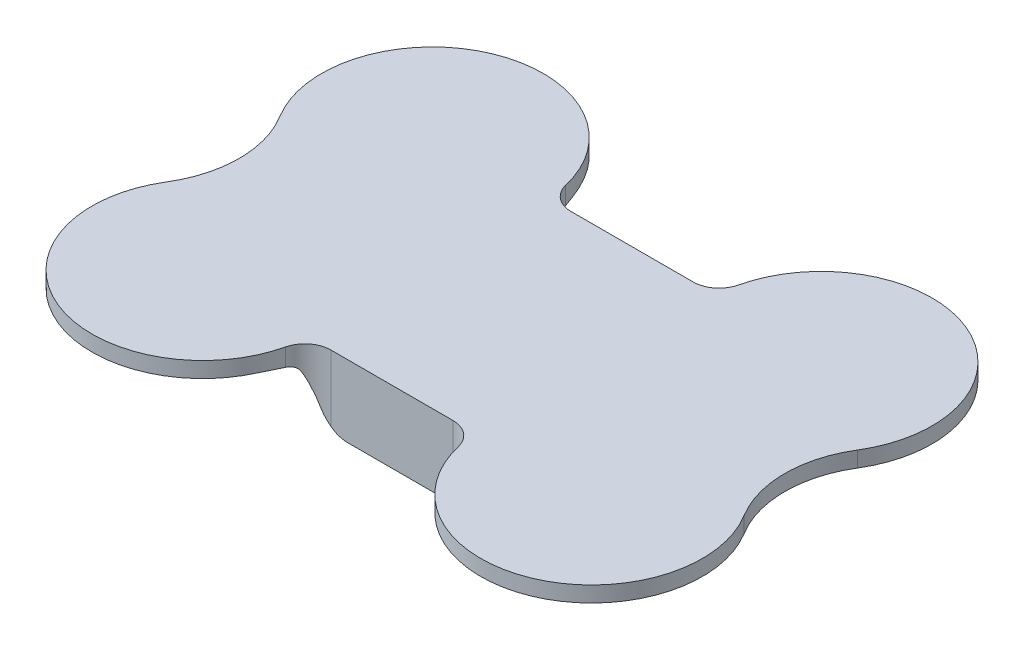
ISO-10303-21;
HEADER;
FILE_DESCRIPTION(('STEP AP214'),'2;1');
FILE_NAME('part.step','',(''),(''),'','','');
FILE_SCHEMA(('AUTOMOTIVE_DESIGN { 1 0 10303 214 1 1 1 1 }'));
ENDSEC;
DATA;
#1=APPLICATION_CONTEXT('core data for automotive mechanical design processes');
#2=APPLICATION_PROTOCOL_DEFINITION('international standard','automotive_design',2000,#1);
#3=PRODUCT_CONTEXT('',#1,'mechanical');
#4=PRODUCT('Part','Part','',(#3));
#5=PRODUCT_RELATED_PRODUCT_CATEGORY('part','',(#4));
#6=PRODUCT_DEFINITION_FORMATION('','',#4);
#7=PRODUCT_DEFINITION_CONTEXT('part definition',#1,'design');
#8=PRODUCT_DEFINITION('design','',#6,#7);
#9=PRODUCT_DEFINITION_SHAPE('','',#8);
#10=(LENGTH_UNIT() NAMED_UNIT(*) SI_UNIT(.MILLI.,.METRE.));
#11=(NAMED_UNIT(*) PLANE_ANGLE_UNIT() SI_UNIT($,.RADIAN.));
#12=(NAMED_UNIT(*) SI_UNIT($,.STERADIAN.) SOLID_ANGLE_UNIT());
#13=UNCERTAINTY_MEASURE_WITH_UNIT(LENGTH_MEASURE(1.E-05),#10,'distance_accuracy_value','');
#14=(GEOMETRIC_REPRESENTATION_CONTEXT(3) GLOBAL_UNCERTAINTY_ASSIGNED_CONTEXT((#13)) GLOBAL_UNIT_ASSIGNED_CONTEXT((#10,
#11,#12)) REPRESENTATION_CONTEXT('',''));
#15=CARTESIAN_POINT('',(0.,0.,0.));
#16=DIRECTION('',(0.,0.,1.));
#17=DIRECTION('',(1.,0.,0.));
#18=AXIS2_PLACEMENT_3D('',#15,#16,#17);
#19=CARTESIAN_POINT('',(-23.3898248877975,29.,46.));
#20=DIRECTION('',(0.,0.,-1.));
#21=DIRECTION('',(-1.,0.,0.));
#22=AXIS2_PLACEMENT_3D('',#19,#20,#21);
#23=PLANE('',#22);
#24=DIRECTION('',(1.,0.,0.));
#25=VECTOR('',#24,1.);
#26=CARTESIAN_POINT('',(-23.3898248877975,1.44303079657456,46.));
#27=LINE('',#26,#25);
#28=CARTESIAN_POINT('',(-17.11441241498,1.44303079657456,46.));
#29=VERTEX_POINT('',#28);
#30=CARTESIAN_POINT('',(17.1144124149762,1.44303079657455,46.));
#31=VERTEX_POINT('',#30);
#32=EDGE_CURVE('E185',#29,#31,#27,.T.);
#33=ORIENTED_EDGE('',*,*,#32,.T.);
#34=CARTESIAN_POINT('',(17.1144124149761,11.4430307965746,46.));
#35=DIRECTION('',(0.,0.,-1.));
#36=DIRECTION('',(-1.,0.,0.));
#37=AXIS2_PLACEMENT_3D('',#34,#35,#36);
#38=CIRCLE('',#37,10.);
#39=CARTESIAN_POINT('',(23.3898248877936,3.65719761726697,46.));
#40=VERTEX_POINT('',#39);
#41=EDGE_CURVE('E265',#31,#40,#38,.F.);
#42=ORIENTED_EDGE('',*,*,#41,.T.);
#43=DIRECTION('',(0.,-1.,0.));
#44=VECTOR('',#43,1.);
#45=CARTESIAN_POINT('',(23.3898248877936,29.,46.));
#46=LINE('',#45,#44);
#47=CARTESIAN_POINT('',(23.3898248877936,29.,46.));
#48=VERTEX_POINT('',#47);
#49=EDGE_CURVE('E520',#48,#40,#46,.T.);
#50=ORIENTED_EDGE('',*,*,#49,.F.);
#51=DIRECTION('',(1.,0.,0.));
#52=VECTOR('',#51,1.);
#53=CARTESIAN_POINT('',(-23.3898248877975,29.,46.));
#54=LINE('',#53,#52);
#55=CARTESIAN_POINT('',(-23.3898248877975,29.,46.));
#56=VERTEX_POINT('',#55);
#57=EDGE_CURVE('E481',#56,#48,#54,.T.);
#58=ORIENTED_EDGE('',*,*,#57,.F.);
#59=DIRECTION('',(0.,-1.,0.));
#60=VECTOR('',#59,1.);
#61=CARTESIAN_POINT('',(-23.3898248877975,29.,46.));
#62=LINE('',#61,#60);
#63=CARTESIAN_POINT('',(-23.3898248877975,3.65719761726697,46.));
#64=VERTEX_POINT('',#63);
#65=EDGE_CURVE('E209',#56,#64,#62,.T.);
#66=ORIENTED_EDGE('',*,*,#65,.T.);
#67=CARTESIAN_POINT('',(-17.11441241498,11.4430307965746,46.));
#68=DIRECTION('',(0.,0.,-1.));
#69=DIRECTION('',(-1.,0.,0.));
#70=AXIS2_PLACEMENT_3D('',#67,#68,#69);
#71=CIRCLE('',#70,10.);
#72=EDGE_CURVE('E200',#64,#29,#71,.F.);
#73=ORIENTED_EDGE('',*,*,#72,.T.);
#74=EDGE_LOOP('',(#33,#42,#50,#58,#66,#73));
#75=FACE_BOUND('',#74,.T.);
#76=ADVANCED_FACE('F43',(#75),#23,.F.);
#77=CARTESIAN_POINT('',(-23.3898248877976,29.,-46.));
#78=DIRECTION('',(0.,0.,1.));
#79=DIRECTION('',(1.,0.,0.));
#80=AXIS2_PLACEMENT_3D('',#77,#78,#79);
#81=PLANE('',#80);
#82=DIRECTION('',(0.,-1.,0.));
#83=VECTOR('',#82,1.);
#84=CARTESIAN_POINT('',(23.3898248877935,29.,-46.));
#85=LINE('',#84,#83);
#86=CARTESIAN_POINT('',(23.3898248877935,29.,-46.));
#87=VERTEX_POINT('',#86);
#88=CARTESIAN_POINT('',(23.3898248877935,3.65719761726694,-46.));
#89=VERTEX_POINT('',#88);
#90=EDGE_CURVE('E504',#87,#89,#85,.T.);
#91=ORIENTED_EDGE('',*,*,#90,.T.);
#92=CARTESIAN_POINT('',(17.1144124149761,11.4430307965746,-46.));
#93=DIRECTION('',(0.,0.,1.));
#94=DIRECTION('',(1.,0.,0.));
#95=AXIS2_PLACEMENT_3D('',#92,#93,#94);
#96=CIRCLE('',#95,10.);
#97=CARTESIAN_POINT('',(17.1144124149762,1.44303079657455,-46.));
#98=VERTEX_POINT('',#97);
#99=EDGE_CURVE('E388',#89,#98,#96,.F.);
#100=ORIENTED_EDGE('',*,*,#99,.T.);
#101=DIRECTION('',(-1.,0.,0.));
#102=VECTOR('',#101,1.);
#103=CARTESIAN_POINT('',(-23.3898248877976,1.44303079657456,-46.));
#104=LINE('',#103,#102);
#105=CARTESIAN_POINT('',(-17.11441241498,1.44303079657456,-46.));
#106=VERTEX_POINT('',#105);
#107=EDGE_CURVE('E379',#98,#106,#104,.T.);
#108=ORIENTED_EDGE('',*,*,#107,.T.);
#109=CARTESIAN_POINT('',(-17.11441241498,11.4430307965746,-46.));
#110=DIRECTION('',(0.,0.,1.));
#111=DIRECTION('',(1.,0.,0.));
#112=AXIS2_PLACEMENT_3D('',#109,#110,#111);
#113=CIRCLE('',#112,10.);
#114=CARTESIAN_POINT('',(-23.3898248877975,3.657197617267,-46.));
#115=VERTEX_POINT('',#114);
#116=EDGE_CURVE('E202',#106,#115,#113,.F.);
#117=ORIENTED_EDGE('',*,*,#116,.T.);
#118=DIRECTION('',(0.,-1.,0.));
#119=VECTOR('',#118,1.);
#120=CARTESIAN_POINT('',(-23.3898248877976,29.,-46.));
#121=LINE('',#120,#119);
#122=CARTESIAN_POINT('',(-23.3898248877976,29.,-46.));
#123=VERTEX_POINT('',#122);
#124=EDGE_CURVE('E501',#123,#115,#121,.T.);
#125=ORIENTED_EDGE('',*,*,#124,.F.);
#126=DIRECTION('',(-1.,0.,0.));
#127=VECTOR('',#126,1.);
#128=CARTESIAN_POINT('',(-23.3898248877976,29.,-46.));
#129=LINE('',#128,#127);
#130=EDGE_CURVE('E68',#87,#123,#129,.T.);
#131=ORIENTED_EDGE('',*,*,#130,.F.);
#132=EDGE_LOOP('',(#91,#100,#108,#117,#125,#131));
#133=FACE_BOUND('',#132,.T.);
#134=ADVANCED_FACE('F337',(#133),#81,.F.);
#135=CARTESIAN_POINT('',(-23.3898248877976,29.,-56.));
#136=DIRECTION('',(0.,-1.,0.));
#137=DIRECTION('',(0.,0.,-1.));
#138=AXIS2_PLACEMENT_3D('',#135,#136,#137);
#139=CYLINDRICAL_SURFACE('',#138,10.);
#140=ORIENTED_EDGE('',*,*,#124,.T.);
#141=CARTESIAN_POINT('',(-23.3898248877976,3.657197617267,-46.));
#142=CARTESIAN_POINT('',(-23.6061617882448,3.8315117228237,-45.9999931890815));
#143=CARTESIAN_POINT('',(-23.8150670842934,4.01481210974495,-46.0070183770402));
#144=CARTESIAN_POINT('',(-24.2164720639477,4.39765014582778,-46.0322007477987));
#145=CARTESIAN_POINT('',(-24.4089823645958,4.59717712078334,-46.0503506630672));
#146=CARTESIAN_POINT('',(-24.7724176547741,5.00654557004747,-46.0943827779591));
#147=CARTESIAN_POINT('',(-24.9437158691171,5.21607569915263,-46.1200915380801));
#148=CARTESIAN_POINT('',(-25.2684516607249,5.64780821533381,-46.1766645187334));
#149=CARTESIAN_POINT('',(-25.4218913160195,5.87000912354029,-46.2075281384243));
#150=CARTESIAN_POINT('',(-25.7365529607919,6.36755952581417,-46.2776853402187));
#151=CARTESIAN_POINT('',(-25.8940692492967,6.64519897189729,-46.3174885267943));
#152=CARTESIAN_POINT('',(-26.1108237269997,7.07374231213734,-46.3770132661162));
#153=CARTESIAN_POINT('',(-26.1802025049657,7.21957897864445,-46.3969520923729));
#154=CARTESIAN_POINT('',(-26.3118656322243,7.51455376951059,-46.4361943199247));
#155=CARTESIAN_POINT('',(-26.3741479723134,7.66369281466285,-46.4554975401671));
#156=CARTESIAN_POINT('',(-26.4328151333181,7.8143435988582,-46.4742343947761));
#157=B_SPLINE_CURVE_WITH_KNOTS('',3,(#141,#142,#143,#144,#145,#146,#147,#148,#149,#150,#151,
#152,#153,#154,#155,#156),.UNSPECIFIED.,.F.,.F.,(4,2,2,2,2,2,2,4),(0.,0.83293449075386,
1.66532542344932,2.4799367776855,3.29445324841723,4.25788013149642,4.74589321729529,
5.23404413193162),.UNSPECIFIED.);
#158=CARTESIAN_POINT('',(-26.4328151333181,7.81434359885818,-46.4742343947758));
#159=VERTEX_POINT('',#158);
#160=EDGE_CURVE('E60',#115,#159,#157,.T.);
#161=ORIENTED_EDGE('',*,*,#160,.T.);
#162=CARTESIAN_POINT('',(-23.3898248877976,-2.22044604925031E-13,-56.));
#163=DIRECTION('',(0.931840271833802,0.362868719771637,0.));
#164=DIRECTION('',(0.362868719771637,-0.931840271833802,0.));
#165=AXIS2_PLACEMENT_3D('',#162,#163,#164);
#166=ELLIPSE('',#165,27.5581758777479,10.);
#167=CARTESIAN_POINT('',(-31.1057454292908,19.8143435988582,-49.638823206563));
#168=VERTEX_POINT('',#167);
#169=EDGE_CURVE('E464',#159,#168,#166,.F.);
#170=ORIENTED_EDGE('',*,*,#169,.T.);
#171=CARTESIAN_POINT('',(-31.1057454292908,19.8143435988582,-49.638823206563));
#172=CARTESIAN_POINT('',(-31.1476775363507,19.922090618271,-49.6896777843476));
#173=CARTESIAN_POINT('',(-31.1926152036915,20.0263768777358,-49.7452161541791));
#174=CARTESIAN_POINT('',(-31.287116126165,20.2273936281226,-49.8649719307865));
#175=CARTESIAN_POINT('',(-31.3366727702306,20.3241345648084,-49.9291769903594));
#176=CARTESIAN_POINT('',(-31.4383908677766,20.5083549052826,-50.0647105300334));
#177=CARTESIAN_POINT('',(-31.4905027098392,20.5959505118559,-50.13591906504));
#178=CARTESIAN_POINT('',(-31.5967800953292,20.7633706547692,-50.2856049995288));
#179=CARTESIAN_POINT('',(-31.6509462532295,20.8431928400955,-50.3640845841685));
#180=CARTESIAN_POINT('',(-31.7598817589516,20.9946813068379,-50.5271841318394));
#181=CARTESIAN_POINT('',(-31.8146463677984,21.0663886997462,-50.6117692248029));
#182=CARTESIAN_POINT('',(-31.924044704029,21.2023562722989,-50.7867724645136));
#183=CARTESIAN_POINT('',(-31.978678439866,21.2666169463692,-50.8771902233789));
#184=CARTESIAN_POINT('',(-32.0873422220399,21.3885014980449,-51.0639141029703));
#185=CARTESIAN_POINT('',(-32.1413647638112,21.4460725001099,-51.1602589926816));
#186=CARTESIAN_POINT('',(-32.247627966526,21.5544657005631,-51.3575977525065));
#187=CARTESIAN_POINT('',(-32.2998685125555,21.6052874643281,-51.4585919214512));
#188=CARTESIAN_POINT('',(-32.4324808099776,21.7292307376236,-51.7263491153502));
#189=CARTESIAN_POINT('',(-32.5109814536245,21.797499828388,-51.8963065485958));
#190=CARTESIAN_POINT('',(-32.6598670046194,21.9201776204464,-52.2446978942618));
#191=CARTESIAN_POINT('',(-32.7302435854818,21.9745721693422,-52.4231402432127));
#192=CARTESIAN_POINT('',(-32.8606723699486,22.0708330865879,-52.7844912318133));
#193=CARTESIAN_POINT('',(-32.9208370504199,22.1128402957206,-52.9673218730754));
#194=CARTESIAN_POINT('',(-33.0033487729648,22.1682925820737,-53.2450983531758));
#195=CARTESIAN_POINT('',(-33.0295425959053,22.1855043625849,-53.3381903333236));
#196=CARTESIAN_POINT('',(-33.0793047713016,22.2176056565592,-53.5254568298038));
#197=CARTESIAN_POINT('',(-33.1028734771446,22.2324954827067,-53.6196311985401));
#198=CARTESIAN_POINT('',(-33.125096337741,22.2463148255691,-53.7142857142852));
#199=B_SPLINE_CURVE_WITH_KNOTS('',3,(#171,#172,#173,#174,#175,#176,#177,#178,#179,#180,#181,
#182,#183,#184,#185,#186,#187,#188,#189,#190,#191,#192,#193,#194,#195,#196,#197,#198),
.UNSPECIFIED.,.F.,.F.,(4,2,2,2,2,2,2,2,2,2,2,2,2,4),(0.,0.378660575785893,0.756787268232595,
1.12929862689969,1.50192230123234,1.87256457417563,2.24318222415749,2.61655437553509,
2.98995055889624,3.58676956437018,4.18419492820068,4.77453973504137,5.06916223910601,
5.3637450337192),.UNSPECIFIED.);
#200=CARTESIAN_POINT('',(-33.1250963377409,22.2463148255681,-53.7142857142857));
#201=VERTEX_POINT('',#200);
#202=EDGE_CURVE('E371',#168,#201,#199,.T.);
#203=ORIENTED_EDGE('',*,*,#202,.T.);
#204=DIRECTION('',(0.,-1.,0.));
#205=VECTOR('',#204,1.);
#206=CARTESIAN_POINT('',(-33.1250963377409,29.,-53.7142857142857));
#207=LINE('',#206,#205);
#208=CARTESIAN_POINT('',(-33.1250963377409,29.,-53.7142857142857));
#209=VERTEX_POINT('',#208);
#210=EDGE_CURVE('E369',#209,#201,#207,.T.);
#211=ORIENTED_EDGE('',*,*,#210,.F.);
#212=CARTESIAN_POINT('',(-23.3898248877976,29.,-56.));
#213=DIRECTION('',(0.,-1.,0.));
#214=DIRECTION('',(0.,0.,-1.));
#215=AXIS2_PLACEMENT_3D('',#212,#213,#214);
#216=CIRCLE('',#215,10.);
#217=EDGE_CURVE('E359',#123,#209,#216,.T.);
#218=ORIENTED_EDGE('',*,*,#217,.F.);
#219=EDGE_LOOP('',(#140,#161,#170,#203,#211,#218));
#220=FACE_BOUND('',#219,.T.);
#221=ADVANCED_FACE('F45',(#220),#139,.F.);
#222=CARTESIAN_POINT('',(-74.5,29.,-43.9999999999999));
#223=DIRECTION('',(0.,-1.,0.));
#224=DIRECTION('',(0.,0.,-1.));
#225=AXIS2_PLACEMENT_3D('',#222,#223,#224);
#226=CYLINDRICAL_SURFACE('',#225,42.5);
#227=ORIENTED_EDGE('',*,*,#210,.T.);
#228=CARTESIAN_POINT('',(-33.1250963377409,22.2463148255681,-53.7142857142857));
#229=CARTESIAN_POINT('',(-33.2811652926862,22.3433049741869,-54.3789763360757));
#230=CARTESIAN_POINT('',(-33.4533632926702,22.4384341530523,-55.0404493237729));
#231=CARTESIAN_POINT('',(-33.8293349989921,22.6148156317605,-56.3536227031552));
#232=CARTESIAN_POINT('',(-34.032994844974,22.6961158332122,-57.0053493887854));
#233=CARTESIAN_POINT('',(-34.3625294663217,22.8006756670201,-57.9767810016295));
#234=CARTESIAN_POINT('',(-34.4764082811571,22.8326354220568,-58.29963234989));
#235=CARTESIAN_POINT('',(-34.7121461686499,22.8894081436433,-58.9430275699533));
#236=CARTESIAN_POINT('',(-34.8340046501833,22.9142216388459,-59.2635716107305));
#237=CARTESIAN_POINT('',(-35.0860954621085,22.9553561324123,-59.9032285925209));
#238=CARTESIAN_POINT('',(-35.2163557537704,22.9716469352762,-60.2223325267503));
#239=CARTESIAN_POINT('',(-35.4847702489465,22.9939511028671,-60.8576664277953));
#240=CARTESIAN_POINT('',(-35.6229267424823,22.9999614703172,-61.1738955297287));
#241=CARTESIAN_POINT('',(-35.7649467884598,23.0000000000001,-61.4884434041212));
#242=B_SPLINE_CURVE_WITH_KNOTS('',3,(#228,#229,#230,#231,#232,#233,#234,#235,#236,#237,#238,
#239,#240,#241),.UNSPECIFIED.,.F.,.F.,(4,2,2,2,2,2,4),(0.,2.06916315926653,4.13100624846071,
5.1623614510924,6.19364033841534,7.22854866845867,8.26375867622955),.UNSPECIFIED.);
#243=CARTESIAN_POINT('',(-35.7649467884598,23.,-61.4884434041211));
#244=VERTEX_POINT('',#243);
#245=EDGE_CURVE('E425',#201,#244,#242,.T.);
#246=ORIENTED_EDGE('',*,*,#245,.T.);
#247=CARTESIAN_POINT('',(-74.5,23.,-43.9999999999999));
#248=DIRECTION('',(0.,1.,0.));
#249=DIRECTION('',(0.,0.,1.));
#250=AXIS2_PLACEMENT_3D('',#247,#248,#249);
#251=CIRCLE('',#250,42.5);
#252=CARTESIAN_POINT('',(-110.703005349997,23.,-21.7380952380951));
#253=VERTEX_POINT('',#252);
#254=EDGE_CURVE('E365',#244,#253,#251,.T.);
#255=ORIENTED_EDGE('',*,*,#254,.T.);
#256=DIRECTION('',(0.,-1.,0.));
#257=VECTOR('',#256,1.);
#258=CARTESIAN_POINT('',(-110.703005349997,29.,-21.7380952380951));
#259=LINE('',#258,#257);
#260=CARTESIAN_POINT('',(-110.703005349997,29.,-21.7380952380951));
#261=VERTEX_POINT('',#260);
#262=EDGE_CURVE('E375',#261,#253,#259,.T.);
#263=ORIENTED_EDGE('',*,*,#262,.F.);
#264=CARTESIAN_POINT('',(-74.5,29.,-43.9999999999999));
#265=DIRECTION('',(0.,1.,0.));
#266=DIRECTION('',(0.,0.,1.));
#267=AXIS2_PLACEMENT_3D('',#264,#265,#266);
#268=CIRCLE('',#267,42.5);
#269=EDGE_CURVE('E361',#209,#261,#268,.T.);
#270=ORIENTED_EDGE('',*,*,#269,.F.);
#271=EDGE_LOOP('',(#227,#246,#255,#263,#270));
#272=FACE_BOUND('',#271,.T.);
#273=ADVANCED_FACE('F345',(#272),#226,.T.);
#274=CARTESIAN_POINT('',(-146.054175279993,29.,0.));
#275=DIRECTION('',(0.,-1.,0.));
#276=DIRECTION('',(0.,0.,-1.));
#277=AXIS2_PLACEMENT_3D('',#274,#275,#276);
#278=CYLINDRICAL_SURFACE('',#277,41.5);
#279=ORIENTED_EDGE('',*,*,#262,.T.);
#280=CARTESIAN_POINT('',(-146.054175279993,23.,0.));
#281=DIRECTION('',(0.,1.,0.));
#282=DIRECTION('',(0.,0.,1.));
#283=AXIS2_PLACEMENT_3D('',#280,#281,#282);
#284=CIRCLE('',#283,41.5);
#285=CARTESIAN_POINT('',(-110.703005349997,23.,21.7380952380953));
#286=VERTEX_POINT('',#285);
#287=EDGE_CURVE('E459',#253,#286,#284,.F.);
#288=ORIENTED_EDGE('',*,*,#287,.T.);
#289=DIRECTION('',(0.,-1.,0.));
#290=VECTOR('',#289,1.);
#291=CARTESIAN_POINT('',(-110.703005349997,29.,21.7380952380953));
#292=LINE('',#291,#290);
#293=CARTESIAN_POINT('',(-110.703005349997,29.,21.7380952380953));
#294=VERTEX_POINT('',#293);
#295=EDGE_CURVE('E382',#294,#286,#292,.T.);
#296=ORIENTED_EDGE('',*,*,#295,.F.);
#297=CARTESIAN_POINT('',(-146.054175279993,29.,0.));
#298=DIRECTION('',(0.,-1.,0.));
#299=DIRECTION('',(0.,0.,1.));
#300=AXIS2_PLACEMENT_3D('',#297,#298,#299);
#301=CIRCLE('',#300,41.5);
#302=EDGE_CURVE('E472',#261,#294,#301,.T.);
#303=ORIENTED_EDGE('',*,*,#302,.F.);
#304=EDGE_LOOP('',(#279,#288,#296,#303));
#305=FACE_BOUND('',#304,.T.);
#306=ADVANCED_FACE('F439',(#305),#278,.F.);
#307=CARTESIAN_POINT('',(-74.5,29.,44.0000000000001));
#308=DIRECTION('',(0.,-1.,0.));
#309=DIRECTION('',(0.,0.,-1.));
#310=AXIS2_PLACEMENT_3D('',#307,#308,#309);
#311=CYLINDRICAL_SURFACE('',#310,42.5);
#312=CARTESIAN_POINT('',(-74.5,23.,44.0000000000001));
#313=DIRECTION('',(0.,1.,0.));
#314=DIRECTION('',(0.,0.,1.));
#315=AXIS2_PLACEMENT_3D('',#312,#313,#314);
#316=CIRCLE('',#315,42.5);
#317=CARTESIAN_POINT('',(-35.7649467884598,23.,61.4884434041213));
#318=VERTEX_POINT('',#317);
#319=EDGE_CURVE('E11',#286,#318,#316,.T.);
#320=ORIENTED_EDGE('',*,*,#319,.T.);
#321=CARTESIAN_POINT('',(-35.7649467884598,23.,61.4884434041211));
#322=CARTESIAN_POINT('',(-35.6229267424823,22.9999614703172,61.1738955297286));
#323=CARTESIAN_POINT('',(-35.4847702489465,22.9939511028671,60.8576664277953));
#324=CARTESIAN_POINT('',(-35.2163557537703,22.9716469352762,60.2223325267503));
#325=CARTESIAN_POINT('',(-35.0860954621084,22.9553561324123,59.9032285925209));
#326=CARTESIAN_POINT('',(-34.8340046501832,22.9142216388459,59.2635716107305));
#327=CARTESIAN_POINT('',(-34.7121461686499,22.8894081436433,58.9430275699533));
#328=CARTESIAN_POINT('',(-34.476408281157,22.8326354220568,58.29963234989));
#329=CARTESIAN_POINT('',(-34.3625294663217,22.8006756670201,57.9767810016295));
#330=CARTESIAN_POINT('',(-34.032994844974,22.6961158332122,57.0053493887854));
#331=CARTESIAN_POINT('',(-33.829334998992,22.6148156317605,56.3536227031552));
#332=CARTESIAN_POINT('',(-33.4533632926702,22.4384341530523,55.0404493237729));
#333=CARTESIAN_POINT('',(-33.2811652926862,22.3433049741869,54.3789763360757));
#334=CARTESIAN_POINT('',(-33.1250963377408,22.246314825568,53.7142857142857));
#335=B_SPLINE_CURVE_WITH_KNOTS('',3,(#321,#322,#323,#324,#325,#326,#327,#328,#329,#330,#331,
#332,#333,#334),.UNSPECIFIED.,.F.,.F.,(4,2,2,2,2,2,4),(0.,1.03521000777088,2.0701183378142,
3.10139722513713,4.1327524277688,6.19459551696296,8.26375867622946),.UNSPECIFIED.);
#336=CARTESIAN_POINT('',(-33.1250963377409,22.246314825568,53.7142857142857));
#337=VERTEX_POINT('',#336);
#338=EDGE_CURVE('E419',#318,#337,#335,.T.);
#339=ORIENTED_EDGE('',*,*,#338,.T.);
#340=DIRECTION('',(0.,-1.,0.));
#341=VECTOR('',#340,1.);
#342=CARTESIAN_POINT('',(-33.1250963377409,29.,53.7142857142857));
#343=LINE('',#342,#341);
#344=CARTESIAN_POINT('',(-33.1250963377409,29.,53.7142857142857));
#345=VERTEX_POINT('',#344);
#346=EDGE_CURVE('E526',#345,#337,#343,.T.);
#347=ORIENTED_EDGE('',*,*,#346,.F.);
#348=CARTESIAN_POINT('',(-74.5,29.,44.0000000000001));
#349=DIRECTION('',(0.,1.,0.));
#350=DIRECTION('',(0.,0.,1.));
#351=AXIS2_PLACEMENT_3D('',#348,#349,#350);
#352=CIRCLE('',#351,42.5);
#353=EDGE_CURVE('E475',#294,#345,#352,.T.);
#354=ORIENTED_EDGE('',*,*,#353,.F.);
#355=ORIENTED_EDGE('',*,*,#295,.T.);
#356=EDGE_LOOP('',(#320,#339,#347,#354,#355));
#357=FACE_BOUND('',#356,.T.);
#358=ADVANCED_FACE('F441',(#357),#311,.T.);
#359=CARTESIAN_POINT('',(-23.3898248877975,29.,56.));
#360=DIRECTION('',(0.,-1.,0.));
#361=DIRECTION('',(0.,0.,-1.));
#362=AXIS2_PLACEMENT_3D('',#359,#360,#361);
#363=CYLINDRICAL_SURFACE('',#362,10.);
#364=CARTESIAN_POINT('',(-23.3898248877975,-3.12250225675825E-13,56.));
#365=DIRECTION('',(0.931840271833802,0.362868719771637,0.));
#366=DIRECTION('',(0.362868719771637,-0.931840271833802,0.));
#367=AXIS2_PLACEMENT_3D('',#364,#365,#366);
#368=ELLIPSE('',#367,27.558175877748,10.);
#369=CARTESIAN_POINT('',(-31.1057454292908,19.8143435988582,49.6388232065628));
#370=VERTEX_POINT('',#369);
#371=CARTESIAN_POINT('',(-26.4328151333181,7.81434359885818,46.4742343947763));
#372=VERTEX_POINT('',#371);
#373=EDGE_CURVE('E53',#370,#372,#368,.F.);
#374=ORIENTED_EDGE('',*,*,#373,.T.);
#375=CARTESIAN_POINT('',(-26.4328151333181,7.81434359885818,46.474234394776));
#376=CARTESIAN_POINT('',(-26.3326680455965,7.55714511824526,46.4422749388621));
#377=CARTESIAN_POINT('',(-26.2219354376698,7.30429897679479,46.4086089518309));
#378=CARTESIAN_POINT('',(-25.9799547331522,6.80856922786565,46.340434985093));
#379=CARTESIAN_POINT('',(-25.8486957692135,6.56569098421576,46.3059265675891));
#380=CARTESIAN_POINT('',(-25.5695625146654,6.09670125141634,46.2394255559779));
#381=CARTESIAN_POINT('',(-25.4221223283611,5.87033709281089,46.2073940934465));
#382=CARTESIAN_POINT('',(-25.1091985354363,5.43001679390015,46.1476329099343));
#383=CARTESIAN_POINT('',(-24.9437232639984,5.21605499111346,46.1199012159878));
#384=CARTESIAN_POINT('',(-24.564016416664,4.76430573351314,46.0670092166692));
#385=CARTESIAN_POINT('',(-24.3463754902753,4.52918836982967,46.0432164799718));
#386=CARTESIAN_POINT('',(-24.0018919591542,4.19120274617689,46.0180723742168));
#387=CARTESIAN_POINT('',(-23.8832075796834,4.08030033759229,46.0114404132317));
#388=CARTESIAN_POINT('',(-23.6404672874441,3.86431010479772,46.0024037116296));
#389=CARTESIAN_POINT('',(-23.5164102978196,3.75922345597101,45.9999998225193));
#390=CARTESIAN_POINT('',(-23.3898248877975,3.65719761726697,46.));
#391=B_SPLINE_CURVE_WITH_KNOTS('',3,(#375,#376,#377,#378,#379,#380,#381,#382,#383,#384,#385,
#386,#387,#388,#389,#390),.UNSPECIFIED.,.F.,.F.,(4,2,2,2,2,2,2,4),(0.,0.833297189125066,
1.66703705701468,2.48224730804665,3.29708238250311,4.25899049378608,4.74648847138315,
5.23408461672504),.UNSPECIFIED.);
#392=EDGE_CURVE('E197',#372,#64,#391,.T.);
#393=ORIENTED_EDGE('',*,*,#392,.T.);
#394=ORIENTED_EDGE('',*,*,#65,.F.);
#395=CARTESIAN_POINT('',(-23.3898248877975,29.,56.));
#396=DIRECTION('',(0.,-1.,0.));
#397=DIRECTION('',(0.,0.,1.));
#398=AXIS2_PLACEMENT_3D('',#395,#396,#397);
#399=CIRCLE('',#398,10.);
#400=EDGE_CURVE('E478',#345,#56,#399,.T.);
#401=ORIENTED_EDGE('',*,*,#400,.F.);
#402=ORIENTED_EDGE('',*,*,#346,.T.);
#403=CARTESIAN_POINT('',(-33.1250963377409,22.246314825568,53.7142857142857));
#404=CARTESIAN_POINT('',(-33.101253435206,22.2314870639949,53.6127301174232));
#405=CARTESIAN_POINT('',(-33.0758610410322,22.2154283346684,53.5117276483209));
#406=CARTESIAN_POINT('',(-33.0220607063317,22.1806232400768,53.3109788477724));
#407=CARTESIAN_POINT('',(-32.9936522511589,22.1618764159363,53.2112327339632));
#408=CARTESIAN_POINT('',(-32.9038938837248,22.1011737951242,52.9136678262421));
#409=CARTESIAN_POINT('',(-32.8381292785175,22.054826676752,52.7180245178716));
#410=CARTESIAN_POINT('',(-32.6950156080275,21.9476108759028,52.3316927479434));
#411=CARTESIAN_POINT('',(-32.6175135689812,21.8865429730842,52.1411159803189));
#412=CARTESIAN_POINT('',(-32.4535341778482,21.7478077242943,51.7703266369186));
#413=CARTESIAN_POINT('',(-32.3670689714543,21.6701626940106,51.5901005372044));
#414=CARTESIAN_POINT('',(-32.2224470352281,21.5293868119408,51.309663945169));
#415=CARTESIAN_POINT('',(-32.166246278197,21.4722223746514,51.2054205114736));
#416=CARTESIAN_POINT('',(-32.0522836788396,21.3500911638666,51.0024674580195));
#417=CARTESIAN_POINT('',(-31.994521838204,21.2851243988213,50.9037578322675));
#418=CARTESIAN_POINT('',(-31.8789198867756,21.1475069181628,50.7134546048317));
#419=CARTESIAN_POINT('',(-31.8210845730595,21.0749258652354,50.6218078622429));
#420=CARTESIAN_POINT('',(-31.7059864728202,20.9213089149995,50.4454943555199));
#421=CARTESIAN_POINT('',(-31.6487235886828,20.8402744871241,50.3608263828456));
#422=CARTESIAN_POINT('',(-31.5478700125508,20.6875253463202,50.2161977960766));
#423=CARTESIAN_POINT('',(-31.5039298394336,20.6174184984764,50.154778717932));
#424=CARTESIAN_POINT('',(-31.417900379086,20.4719080993714,50.0371727323254));
#425=CARTESIAN_POINT('',(-31.3758105406457,20.3965061431347,49.9809842610283));
#426=CARTESIAN_POINT('',(-31.2936999560296,20.2396142703463,49.8735504576438));
#427=CARTESIAN_POINT('',(-31.2537095112564,20.15806297893,49.8223713305328));
#428=CARTESIAN_POINT('',(-31.1770432738497,19.9899048277424,49.7260032882388));
#429=CARTESIAN_POINT('',(-31.1403705229458,19.9032934461205,49.6808198526662));
#430=CARTESIAN_POINT('',(-31.1057454292908,19.8143435988581,49.6388232065629));
#431=B_SPLINE_CURVE_WITH_KNOTS('',3,(#403,#404,#405,#406,#407,#408,#409,#410,#411,#412,#413,
#414,#415,#416,#417,#418,#419,#420,#421,#422,#423,#424,#425,#426,#427,#428,#429,#430),
.UNSPECIFIED.,.F.,.F.,(4,2,2,2,2,2,2,2,2,2,2,2,2,4),(0.,0.316055104841744,0.632164226744241,
1.2659397437244,1.9088281890893,2.55085659137781,2.94506078012247,3.33926454193671,
3.73013303972389,4.12093370648334,4.42980258255912,4.73857881511617,5.05100118053802,
5.36370713829307),.UNSPECIFIED.);
#432=EDGE_CURVE('E401',#337,#370,#431,.T.);
#433=ORIENTED_EDGE('',*,*,#432,.T.);
#434=EDGE_LOOP('',(#374,#393,#394,#401,#402,#433));
#435=FACE_BOUND('',#434,.T.);
#436=ADVANCED_FACE('F229',(#435),#363,.F.);
#437=CARTESIAN_POINT('',(23.3898248877936,29.,56.));
#438=DIRECTION('',(0.,-1.,0.));
#439=DIRECTION('',(0.,0.,-1.));
#440=AXIS2_PLACEMENT_3D('',#437,#438,#439);
#441=CYLINDRICAL_SURFACE('',#440,10.);
#442=CARTESIAN_POINT('',(23.3898248877936,-2.98372437868011E-13,56.));
#443=DIRECTION('',(-0.931840271833802,0.362868719771637,0.));
#444=DIRECTION('',(-0.362868719771637,-0.931840271833802,0.));
#445=AXIS2_PLACEMENT_3D('',#442,#443,#444);
#446=ELLIPSE('',#445,27.5581758777479,10.);
#447=CARTESIAN_POINT('',(26.4328151333141,7.81434359885819,46.474234394776));
#448=VERTEX_POINT('',#447);
#449=CARTESIAN_POINT('',(31.1057454292869,19.8143435988582,49.638823206563));
#450=VERTEX_POINT('',#449);
#451=EDGE_CURVE('E320',#448,#450,#446,.F.);
#452=ORIENTED_EDGE('',*,*,#451,.T.);
#453=CARTESIAN_POINT('',(31.1057454292869,19.8143435988582,49.6388232065628));
#454=CARTESIAN_POINT('',(31.1476775363467,19.9220906182709,49.6896777843475));
#455=CARTESIAN_POINT('',(31.1926152036875,20.0263768777357,49.7452161541791));
#456=CARTESIAN_POINT('',(31.287116126161,20.2273936281225,49.8649719307865));
#457=CARTESIAN_POINT('',(31.3366727702266,20.3241345648084,49.9291769903594));
#458=CARTESIAN_POINT('',(31.4383908677727,20.5083549052825,50.0647105300334));
#459=CARTESIAN_POINT('',(31.4905027098352,20.5959505118559,50.13591906504));
#460=CARTESIAN_POINT('',(31.5967800953252,20.7633706547692,50.2856049995289));
#461=CARTESIAN_POINT('',(31.6509462532255,20.8431928400955,50.3640845841685));
#462=CARTESIAN_POINT('',(31.7598817589477,20.9946813068379,50.5271841318394));
#463=CARTESIAN_POINT('',(31.8146463677944,21.0663886997462,50.6117692248029));
#464=CARTESIAN_POINT('',(31.924044704025,21.2023562722988,50.7867724645136));
#465=CARTESIAN_POINT('',(31.9786784398621,21.2666169463692,50.8771902233789));
#466=CARTESIAN_POINT('',(32.087342222036,21.3885014980449,51.0639141029703));
#467=CARTESIAN_POINT('',(32.1413647638073,21.4460725001099,51.1602589926816));
#468=CARTESIAN_POINT('',(32.2476279665221,21.5544657005631,51.3575977525066));
#469=CARTESIAN_POINT('',(32.2998685125516,21.6052874643281,51.4585919214512));
#470=CARTESIAN_POINT('',(32.4324808099736,21.7292307376235,51.7263491153502));
#471=CARTESIAN_POINT('',(32.5109814536205,21.797499828388,51.8963065485958));
#472=CARTESIAN_POINT('',(32.6598670046155,21.9201776204464,52.2446978942618));
#473=CARTESIAN_POINT('',(32.7302435854779,21.9745721693422,52.4231402432127));
#474=CARTESIAN_POINT('',(32.8606723699446,22.0708330865879,52.7844912318133));
#475=CARTESIAN_POINT('',(32.9208370504159,22.1128402957206,52.9673218730754));
#476=CARTESIAN_POINT('',(33.0033487729608,22.1682925820737,53.2450983531758));
#477=CARTESIAN_POINT('',(33.0295425959013,22.1855043625848,53.3381903333236));
#478=CARTESIAN_POINT('',(33.0793047712976,22.2176056565591,53.5254568298038));
#479=CARTESIAN_POINT('',(33.1028734771406,22.2324954827066,53.6196311985401));
#480=CARTESIAN_POINT('',(33.125096337737,22.246314825569,53.7142857142852));
#481=B_SPLINE_CURVE_WITH_KNOTS('',3,(#453,#454,#455,#456,#457,#458,#459,#460,#461,#462,#463,
#464,#465,#466,#467,#468,#469,#470,#471,#472,#473,#474,#475,#476,#477,#478,#479,#480),
.UNSPECIFIED.,.F.,.F.,(4,2,2,2,2,2,2,2,2,2,2,2,2,4),(0.,0.378660575785892,0.756787268232593,
1.12929862689972,1.50192230123237,1.87256457417566,2.24318222415754,2.61655437553515,
2.9899505588963,3.58676956437023,4.18419492820073,4.77453973504142,5.06916223910606,
5.36374503371926),.UNSPECIFIED.);
#482=CARTESIAN_POINT('',(33.1250963377369,22.246314825568,53.7142857142857));
#483=VERTEX_POINT('',#482);
#484=EDGE_CURVE('E277',#450,#483,#481,.T.);
#485=ORIENTED_EDGE('',*,*,#484,.T.);
#486=DIRECTION('',(0.,-1.,0.));
#487=VECTOR('',#486,1.);
#488=CARTESIAN_POINT('',(33.1250963377369,29.,53.7142857142857));
#489=LINE('',#488,#487);
#490=CARTESIAN_POINT('',(33.1250963377369,29.,53.7142857142857));
#491=VERTEX_POINT('',#490);
#492=EDGE_CURVE('E516',#491,#483,#489,.T.);
#493=ORIENTED_EDGE('',*,*,#492,.F.);
#494=CARTESIAN_POINT('',(23.3898248877936,29.,56.));
#495=DIRECTION('',(0.,-1.,0.));
#496=DIRECTION('',(0.,0.,-1.));
#497=AXIS2_PLACEMENT_3D('',#494,#495,#496);
#498=CIRCLE('',#497,10.);
#499=EDGE_CURVE('E484',#48,#491,#498,.T.);
#500=ORIENTED_EDGE('',*,*,#499,.F.);
#501=ORIENTED_EDGE('',*,*,#49,.T.);
#502=CARTESIAN_POINT('',(23.3898248877936,3.65719761726697,46.));
#503=CARTESIAN_POINT('',(23.6061617882409,3.83151172282367,45.9999931890815));
#504=CARTESIAN_POINT('',(23.8150670842894,4.01481210974492,46.0070183770402));
#505=CARTESIAN_POINT('',(24.2164720639437,4.39765014582775,46.0322007477987));
#506=CARTESIAN_POINT('',(24.4089823645918,4.59717712078331,46.0503506630672));
#507=CARTESIAN_POINT('',(24.7724176547701,5.00654557004743,46.0943827779591));
#508=CARTESIAN_POINT('',(24.9437158691132,5.21607569915259,46.1200915380801));
#509=CARTESIAN_POINT('',(25.268451660721,5.64780821533378,46.1766645187334));
#510=CARTESIAN_POINT('',(25.4218913160155,5.87000912354026,46.2075281384243));
#511=CARTESIAN_POINT('',(25.7365529607879,6.36755952581414,46.2776853402187));
#512=CARTESIAN_POINT('',(25.8940692492928,6.64519897189726,46.3174885267943));
#513=CARTESIAN_POINT('',(26.1108237269957,7.07374231213731,46.3770132661162));
#514=CARTESIAN_POINT('',(26.1802025049618,7.21957897864442,46.3969520923729));
#515=CARTESIAN_POINT('',(26.3118656322204,7.51455376951057,46.4361943199247));
#516=CARTESIAN_POINT('',(26.3741479723095,7.66369281466283,46.4554975401671));
#517=CARTESIAN_POINT('',(26.4328151333141,7.81434359885817,46.4742343947761));
#518=B_SPLINE_CURVE_WITH_KNOTS('',3,(#502,#503,#504,#505,#506,#507,#508,#509,#510,#511,#512,
#513,#514,#515,#516,#517),.UNSPECIFIED.,.F.,.F.,(4,2,2,2,2,2,2,4),(0.,0.832934490753861,
1.66532542344932,2.4799367776855,3.29445324841723,4.25788013149644,4.74589321729531,
5.23404413193165),.UNSPECIFIED.);
#519=EDGE_CURVE('E256',#40,#448,#518,.T.);
#520=ORIENTED_EDGE('',*,*,#519,.T.);
#521=EDGE_LOOP('',(#452,#485,#493,#500,#501,#520));
#522=FACE_BOUND('',#521,.T.);
#523=ADVANCED_FACE('F267',(#522),#441,.F.);
#524=CARTESIAN_POINT('',(74.499999999996,29.,44.0000000000001));
#525=DIRECTION('',(0.,-1.,0.));
#526=DIRECTION('',(0.,0.,-1.));
#527=AXIS2_PLACEMENT_3D('',#524,#525,#526);
#528=CYLINDRICAL_SURFACE('',#527,42.5);
#529=CARTESIAN_POINT('',(74.499999999996,23.,44.0000000000001));
#530=DIRECTION('',(0.,1.,0.));
#531=DIRECTION('',(0.,0.,1.));
#532=AXIS2_PLACEMENT_3D('',#529,#530,#531);
#533=CIRCLE('',#532,42.5);
#534=CARTESIAN_POINT('',(35.7649467884559,23.,61.4884434041212));
#535=VERTEX_POINT('',#534);
#536=CARTESIAN_POINT('',(110.703005349993,23.,21.7380952380952));
#537=VERTEX_POINT('',#536);
#538=EDGE_CURVE('E540',#535,#537,#533,.T.);
#539=ORIENTED_EDGE('',*,*,#538,.T.);
#540=DIRECTION('',(0.,-1.,0.));
#541=VECTOR('',#540,1.);
#542=CARTESIAN_POINT('',(110.703005349993,29.,21.7380952380952));
#543=LINE('',#542,#541);
#544=CARTESIAN_POINT('',(110.703005349993,29.,21.7380952380952));
#545=VERTEX_POINT('',#544);
#546=EDGE_CURVE('E513',#545,#537,#543,.T.);
#547=ORIENTED_EDGE('',*,*,#546,.F.);
#548=CARTESIAN_POINT('',(74.499999999996,29.,44.0000000000001));
#549=DIRECTION('',(0.,1.,0.));
#550=DIRECTION('',(0.,0.,1.));
#551=AXIS2_PLACEMENT_3D('',#548,#549,#550);
#552=CIRCLE('',#551,42.5);
#553=EDGE_CURVE('E487',#491,#545,#552,.T.);
#554=ORIENTED_EDGE('',*,*,#553,.F.);
#555=ORIENTED_EDGE('',*,*,#492,.T.);
#556=CARTESIAN_POINT('',(33.1250963377369,22.246314825568,53.7142857142857));
#557=CARTESIAN_POINT('',(33.2811652926823,22.3433049741869,54.3789763360757));
#558=CARTESIAN_POINT('',(33.4533632926662,22.4384341530523,55.0404493237729));
#559=CARTESIAN_POINT('',(33.8293349989881,22.6148156317605,56.3536227031552));
#560=CARTESIAN_POINT('',(34.03299484497,22.6961158332122,57.0053493887854));
#561=CARTESIAN_POINT('',(34.3625294663177,22.8006756670201,57.9767810016295));
#562=CARTESIAN_POINT('',(34.4764082811531,22.8326354220568,58.29963234989));
#563=CARTESIAN_POINT('',(34.7121461686459,22.8894081436433,58.9430275699533));
#564=CARTESIAN_POINT('',(34.8340046501793,22.9142216388459,59.2635716107305));
#565=CARTESIAN_POINT('',(35.0860954621045,22.9553561324123,59.9032285925209));
#566=CARTESIAN_POINT('',(35.2163557537663,22.9716469352762,60.2223325267503));
#567=CARTESIAN_POINT('',(35.4847702489425,22.9939511028671,60.8576664277953));
#568=CARTESIAN_POINT('',(35.6229267424783,22.9999614703172,61.1738955297286));
#569=CARTESIAN_POINT('',(35.7649467884558,23.0000000000001,61.4884434041212));
#570=B_SPLINE_CURVE_WITH_KNOTS('',3,(#556,#557,#558,#559,#560,#561,#562,#563,#564,#565,#566,
#567,#568,#569),.UNSPECIFIED.,.F.,.F.,(4,2,2,2,2,2,4),(0.,2.06916315926651,4.13100624846068,
5.16236145109236,6.19364033841529,7.22854866845863,8.2637586762295),.UNSPECIFIED.);
#571=EDGE_CURVE('E287',#483,#535,#570,.T.);
#572=ORIENTED_EDGE('',*,*,#571,.T.);
#573=EDGE_LOOP('',(#539,#547,#554,#555,#572));
#574=FACE_BOUND('',#573,.T.);
#575=ADVANCED_FACE('F271',(#574),#528,.T.);
#576=CARTESIAN_POINT('',(146.054175279989,29.,0.));
#577=DIRECTION('',(0.,-1.,0.));
#578=DIRECTION('',(0.,0.,-1.));
#579=AXIS2_PLACEMENT_3D('',#576,#577,#578);
#580=CYLINDRICAL_SURFACE('',#579,41.5);
#581=ORIENTED_EDGE('',*,*,#546,.T.);
#582=CARTESIAN_POINT('',(146.054175279989,23.,0.));
#583=DIRECTION('',(0.,1.,0.));
#584=DIRECTION('',(0.,0.,1.));
#585=AXIS2_PLACEMENT_3D('',#582,#583,#584);
#586=CIRCLE('',#585,41.5);
#587=CARTESIAN_POINT('',(110.703005349993,23.,-21.7380952380951));
#588=VERTEX_POINT('',#587);
#589=EDGE_CURVE('E286',#537,#588,#586,.F.);
#590=ORIENTED_EDGE('',*,*,#589,.T.);
#591=DIRECTION('',(0.,-1.,0.));
#592=VECTOR('',#591,1.);
#593=CARTESIAN_POINT('',(110.703005349993,29.,-21.7380952380951));
#594=LINE('',#593,#592);
#595=CARTESIAN_POINT('',(110.703005349993,29.,-21.7380952380951));
#596=VERTEX_POINT('',#595);
#597=EDGE_CURVE('E510',#596,#588,#594,.T.);
#598=ORIENTED_EDGE('',*,*,#597,.F.);
#599=CARTESIAN_POINT('',(146.054175279989,29.,0.));
#600=DIRECTION('',(0.,-1.,0.));
#601=DIRECTION('',(0.,0.,-1.));
#602=AXIS2_PLACEMENT_3D('',#599,#600,#601);
#603=CIRCLE('',#602,41.5);
#604=EDGE_CURVE('E490',#545,#596,#603,.T.);
#605=ORIENTED_EDGE('',*,*,#604,.F.);
#606=EDGE_LOOP('',(#581,#590,#598,#605));
#607=FACE_BOUND('',#606,.T.);
#608=ADVANCED_FACE('F325',(#607),#580,.F.);
#609=CARTESIAN_POINT('',(74.499999999996,29.,-44.));
#610=DIRECTION('',(0.,-1.,0.));
#611=DIRECTION('',(0.,0.,-1.));
#612=AXIS2_PLACEMENT_3D('',#609,#610,#611);
#613=CYLINDRICAL_SURFACE('',#612,42.5);
#614=ORIENTED_EDGE('',*,*,#597,.T.);
#615=CARTESIAN_POINT('',(74.499999999996,23.,-44.));
#616=DIRECTION('',(0.,1.,0.));
#617=DIRECTION('',(0.,0.,1.));
#618=AXIS2_PLACEMENT_3D('',#615,#616,#617);
#619=CIRCLE('',#618,42.5);
#620=CARTESIAN_POINT('',(35.7649467884559,23.,-61.4884434041214));
#621=VERTEX_POINT('',#620);
#622=EDGE_CURVE('E397',#588,#621,#619,.T.);
#623=ORIENTED_EDGE('',*,*,#622,.T.);
#624=CARTESIAN_POINT('',(35.7649467884559,23.,-61.4884434041214));
#625=CARTESIAN_POINT('',(35.6229267424784,22.9999614703172,-61.1738955297288));
#626=CARTESIAN_POINT('',(35.4847702489426,22.9939511028671,-60.8576664277954));
#627=CARTESIAN_POINT('',(35.2163557537664,22.9716469352762,-60.2223325267504));
#628=CARTESIAN_POINT('',(35.0860954621045,22.9553561324123,-59.903228592521));
#629=CARTESIAN_POINT('',(34.8340046501793,22.9142216388459,-59.2635716107306));
#630=CARTESIAN_POINT('',(34.712146168646,22.8894081436433,-58.9430275699534));
#631=CARTESIAN_POINT('',(34.4764082811531,22.8326354220568,-58.2996323498901));
#632=CARTESIAN_POINT('',(34.3625294663178,22.8006756670201,-57.9767810016296));
#633=CARTESIAN_POINT('',(34.03299484497,22.6961158332122,-57.0053493887855));
#634=CARTESIAN_POINT('',(33.8293349989881,22.6148156317605,-56.3536227031552));
#635=CARTESIAN_POINT('',(33.4533632926662,22.4384341530523,-55.0404493237729));
#636=CARTESIAN_POINT('',(33.2811652926823,22.3433049741869,-54.3789763360757));
#637=CARTESIAN_POINT('',(33.1250963377369,22.246314825568,-53.7142857142857));
#638=B_SPLINE_CURVE_WITH_KNOTS('',3,(#624,#625,#626,#627,#628,#629,#630,#631,#632,#633,#634,
#635,#636,#637),.UNSPECIFIED.,.F.,.F.,(4,2,2,2,2,2,4),(0.,1.0352100077709,2.07011833781427,
3.10139722513723,4.13275242776893,6.19459551696316,8.26375867622973),.UNSPECIFIED.);
#639=CARTESIAN_POINT('',(33.1250963377369,22.246314825568,-53.7142857142857));
#640=VERTEX_POINT('',#639);
#641=EDGE_CURVE('E312',#621,#640,#638,.T.);
#642=ORIENTED_EDGE('',*,*,#641,.T.);
#643=DIRECTION('',(0.,-1.,0.));
#644=VECTOR('',#643,1.);
#645=CARTESIAN_POINT('',(33.1250963377369,29.,-53.7142857142857));
#646=LINE('',#645,#644);
#647=CARTESIAN_POINT('',(33.1250963377369,29.,-53.7142857142857));
#648=VERTEX_POINT('',#647);
#649=EDGE_CURVE('E507',#648,#640,#646,.T.);
#650=ORIENTED_EDGE('',*,*,#649,.F.);
#651=CARTESIAN_POINT('',(74.499999999996,29.,-44.));
#652=DIRECTION('',(0.,1.,0.));
#653=DIRECTION('',(0.,0.,1.));
#654=AXIS2_PLACEMENT_3D('',#651,#652,#653);
#655=CIRCLE('',#654,42.5);
#656=EDGE_CURVE('E493',#596,#648,#655,.T.);
#657=ORIENTED_EDGE('',*,*,#656,.F.);
#658=EDGE_LOOP('',(#614,#623,#642,#650,#657));
#659=FACE_BOUND('',#658,.T.);
#660=ADVANCED_FACE('F321',(#659),#613,.T.);
#661=CARTESIAN_POINT('',(23.3898248877935,29.,-56.));
#662=DIRECTION('',(0.,-1.,0.));
#663=DIRECTION('',(0.,0.,-1.));
#664=AXIS2_PLACEMENT_3D('',#661,#662,#663);
#665=CYLINDRICAL_SURFACE('',#664,10.);
#666=ORIENTED_EDGE('',*,*,#649,.T.);
#667=CARTESIAN_POINT('',(33.1250963377369,22.246314825568,-53.7142857142857));
#668=CARTESIAN_POINT('',(33.101253435202,22.2314870639949,-53.6127301174231));
#669=CARTESIAN_POINT('',(33.0758610410282,22.2154283346684,-53.5117276483209));
#670=CARTESIAN_POINT('',(33.0220607063277,22.1806232400768,-53.3109788477724));
#671=CARTESIAN_POINT('',(32.9936522511549,22.1618764159363,-53.2112327339632));
#672=CARTESIAN_POINT('',(32.9038938837208,22.1011737951242,-52.9136678262421));
#673=CARTESIAN_POINT('',(32.8381292785135,22.054826676752,-52.7180245178716));
#674=CARTESIAN_POINT('',(32.6950156080235,21.9476108759028,-52.3316927479434));
#675=CARTESIAN_POINT('',(32.6175135689772,21.8865429730842,-52.1411159803189));
#676=CARTESIAN_POINT('',(32.4535341778442,21.7478077242943,-51.7703266369186));
#677=CARTESIAN_POINT('',(32.3670689714503,21.6701626940105,-51.5901005372044));
#678=CARTESIAN_POINT('',(32.2224470352241,21.5293868119408,-51.3096639451689));
#679=CARTESIAN_POINT('',(32.166246278193,21.4722223746514,-51.2054205114736));
#680=CARTESIAN_POINT('',(32.0522836788356,21.3500911638665,-51.0024674580194));
#681=CARTESIAN_POINT('',(31.9945218382,21.2851243988213,-50.9037578322675));
#682=CARTESIAN_POINT('',(31.8789198867716,21.1475069181627,-50.7134546048317));
#683=CARTESIAN_POINT('',(31.8210845730555,21.0749258652354,-50.6218078622429));
#684=CARTESIAN_POINT('',(31.7059864728162,20.9213089149994,-50.4454943555199));
#685=CARTESIAN_POINT('',(31.6487235886789,20.840274487124,-50.3608263828456));
#686=CARTESIAN_POINT('',(31.5478700125469,20.6875253463202,-50.2161977960766));
#687=CARTESIAN_POINT('',(31.5039298394296,20.6174184984763,-50.154778717932));
#688=CARTESIAN_POINT('',(31.417900379082,20.4719080993714,-50.0371727323254));
#689=CARTESIAN_POINT('',(31.3758105406418,20.3965061431347,-49.9809842610283));
#690=CARTESIAN_POINT('',(31.2936999560257,20.2396142703463,-49.8735504576439));
#691=CARTESIAN_POINT('',(31.2537095112525,20.15806297893,-49.8223713305328));
#692=CARTESIAN_POINT('',(31.1770432738458,19.9899048277425,-49.7260032882389));
#693=CARTESIAN_POINT('',(31.1403705229419,19.9032934461206,-49.6808198526663));
#694=CARTESIAN_POINT('',(31.1057454292869,19.8143435988583,-49.638823206563));
#695=B_SPLINE_CURVE_WITH_KNOTS('',3,(#667,#668,#669,#670,#671,#672,#673,#674,#675,#676,#677,
#678,#679,#680,#681,#682,#683,#684,#685,#686,#687,#688,#689,#690,#691,#692,#693,#694),
.UNSPECIFIED.,.F.,.F.,(4,2,2,2,2,2,2,2,2,2,2,2,2,4),(0.,0.316055104841736,0.632164226744232,
1.2659397437244,1.9088281890893,2.55085659137781,2.94506078012248,3.3392645419367,
3.73013303972387,4.12093370648332,4.42980258255903,4.73857881511603,5.05100118053782,
5.36370713829282),.UNSPECIFIED.);
#696=CARTESIAN_POINT('',(31.1057454292869,19.8143435988582,-49.6388232065629));
#697=VERTEX_POINT('',#696);
#698=EDGE_CURVE('E304',#640,#697,#695,.T.);
#699=ORIENTED_EDGE('',*,*,#698,.T.);
#700=CARTESIAN_POINT('',(23.3898248877935,-3.92047505570758E-13,-56.));
#701=DIRECTION('',(-0.931840271833802,0.362868719771637,0.));
#702=DIRECTION('',(-0.362868719771637,-0.931840271833802,0.));
#703=AXIS2_PLACEMENT_3D('',#700,#701,#702);
#704=ELLIPSE('',#703,27.5581758777479,10.);
#705=CARTESIAN_POINT('',(26.4328151333141,7.81434359885819,-46.4742343947762));
#706=VERTEX_POINT('',#705);
#707=EDGE_CURVE('E391',#697,#706,#704,.F.);
#708=ORIENTED_EDGE('',*,*,#707,.T.);
#709=CARTESIAN_POINT('',(26.4328151333141,7.81434359885819,-46.4742343947762));
#710=CARTESIAN_POINT('',(26.3326680455925,7.55714511824528,-46.4422749388622));
#711=CARTESIAN_POINT('',(26.2219354376658,7.30429897679482,-46.4086089518309));
#712=CARTESIAN_POINT('',(25.9799547331483,6.80856922786569,-46.3404349850929));
#713=CARTESIAN_POINT('',(25.8486957692096,6.56569098421581,-46.3059265675891));
#714=CARTESIAN_POINT('',(25.5695625146615,6.09670125141639,-46.2394255559779));
#715=CARTESIAN_POINT('',(25.4221223283572,5.87033709281094,-46.2073940934465));
#716=CARTESIAN_POINT('',(25.1091985354324,5.4300167939002,-46.1476329099343));
#717=CARTESIAN_POINT('',(24.9437232639945,5.21605499111352,-46.1199012159878));
#718=CARTESIAN_POINT('',(24.5640164166601,4.76430573351318,-46.0670092166692));
#719=CARTESIAN_POINT('',(24.3463754902713,4.5291883698297,-46.0432164799718));
#720=CARTESIAN_POINT('',(24.0018919591503,4.19120274617689,-46.0180723742168));
#721=CARTESIAN_POINT('',(23.8832075796795,4.08030033759228,-46.0114404132317));
#722=CARTESIAN_POINT('',(23.6404672874401,3.8643101047977,-46.0024037116296));
#723=CARTESIAN_POINT('',(23.5164102978156,3.75922345597099,-45.9999998225193));
#724=CARTESIAN_POINT('',(23.3898248877935,3.65719761726694,-46.));
#725=B_SPLINE_CURVE_WITH_KNOTS('',3,(#709,#710,#711,#712,#713,#714,#715,#716,#717,#718,#719,
#720,#721,#722,#723,#724),.UNSPECIFIED.,.F.,.F.,(4,2,2,2,2,2,2,4),(0.,0.833297189125058,
1.66703705701466,2.48224730804662,3.29708238250307,4.2589904937861,4.7464884713832,
5.23408461672512),.UNSPECIFIED.);
#726=EDGE_CURVE('E196',#706,#89,#725,.T.);
#727=ORIENTED_EDGE('',*,*,#726,.T.);
#728=ORIENTED_EDGE('',*,*,#90,.F.);
#729=CARTESIAN_POINT('',(23.3898248877935,29.,-56.));
#730=DIRECTION('',(0.,-1.,0.));
#731=DIRECTION('',(0.,0.,-1.));
#732=AXIS2_PLACEMENT_3D('',#729,#730,#731);
#733=CIRCLE('',#732,10.);
#734=EDGE_CURVE('E496',#648,#87,#733,.T.);
#735=ORIENTED_EDGE('',*,*,#734,.F.);
#736=EDGE_LOOP('',(#666,#699,#708,#727,#728,#735));
#737=FACE_BOUND('',#736,.T.);
#738=ADVANCED_FACE('F324',(#737),#665,.F.);
#739=CARTESIAN_POINT('',(-23.3898248877976,29.,-56.));
#740=DIRECTION('',(0.,-1.,0.));
#741=DIRECTION('',(0.,0.,-1.));
#742=AXIS2_PLACEMENT_3D('',#739,#740,#741);
#743=PLANE('',#742);
#744=ORIENTED_EDGE('',*,*,#217,.T.);
#745=ORIENTED_EDGE('',*,*,#269,.T.);
#746=ORIENTED_EDGE('',*,*,#302,.T.);
#747=ORIENTED_EDGE('',*,*,#353,.T.);
#748=ORIENTED_EDGE('',*,*,#400,.T.);
#749=ORIENTED_EDGE('',*,*,#57,.T.);
#750=ORIENTED_EDGE('',*,*,#499,.T.);
#751=ORIENTED_EDGE('',*,*,#553,.T.);
#752=ORIENTED_EDGE('',*,*,#604,.T.);
#753=ORIENTED_EDGE('',*,*,#656,.T.);
#754=ORIENTED_EDGE('',*,*,#734,.T.);
#755=ORIENTED_EDGE('',*,*,#130,.T.);
#756=EDGE_LOOP('',(#744,#745,#746,#747,#748,#749,#750,#751,#752,#753,#754,#755));
#757=FACE_BOUND('',#756,.T.);
#758=ADVANCED_FACE('F348',(#757),#743,.F.);
#759=CARTESIAN_POINT('',(-117.,23.,432.703214676325));
#760=DIRECTION('',(0.,1.,0.));
#761=DIRECTION('',(0.,0.,1.));
#762=AXIS2_PLACEMENT_3D('',#759,#760,#761);
#763=PLANE('',#762);
#764=ORIENTED_EDGE('',*,*,#254,.F.);
#765=DIRECTION('',(0.,0.,-1.));
#766=VECTOR('',#765,1.);
#767=CARTESIAN_POINT('',(-35.7649467884598,23.,432.703214676325));
#768=LINE('',#767,#766);
#769=EDGE_CURVE('E461',#318,#244,#768,.T.);
#770=ORIENTED_EDGE('',*,*,#769,.F.);
#771=ORIENTED_EDGE('',*,*,#319,.F.);
#772=ORIENTED_EDGE('',*,*,#287,.F.);
#773=EDGE_LOOP('',(#764,#770,#771,#772));
#774=FACE_BOUND('',#773,.T.);
#775=ADVANCED_FACE('F350',(#774),#763,.F.);
#776=CARTESIAN_POINT('',(-31.1057454292908,19.8143435988582,432.703214676325));
#777=DIRECTION('',(0.931840271833802,0.362868719771637,0.));
#778=DIRECTION('',(-0.362868719771637,0.931840271833802,0.));
#779=AXIS2_PLACEMENT_3D('',#776,#777,#778);
#780=PLANE('',#779);
#781=ORIENTED_EDGE('',*,*,#169,.F.);
#782=DIRECTION('',(0.,0.,-1.));
#783=VECTOR('',#782,1.);
#784=CARTESIAN_POINT('',(-26.4328151333181,7.81434359885818,432.703214676325));
#785=LINE('',#784,#783);
#786=EDGE_CURVE('E204',#372,#159,#785,.T.);
#787=ORIENTED_EDGE('',*,*,#786,.F.);
#788=ORIENTED_EDGE('',*,*,#373,.F.);
#789=DIRECTION('',(0.,0.,-1.));
#790=VECTOR('',#789,1.);
#791=CARTESIAN_POINT('',(-31.1057454292908,19.8143435988582,432.703214676325));
#792=LINE('',#791,#790);
#793=EDGE_CURVE('E551',#370,#168,#792,.T.);
#794=ORIENTED_EDGE('',*,*,#793,.T.);
#795=EDGE_LOOP('',(#781,#787,#788,#794));
#796=FACE_BOUND('',#795,.T.);
#797=ADVANCED_FACE('F237',(#796),#780,.F.);
#798=CARTESIAN_POINT('',(-35.7649467884598,18.,432.703214676325));
#799=DIRECTION('',(0.,0.,-1.));
#800=DIRECTION('',(-1.,0.,0.));
#801=AXIS2_PLACEMENT_3D('',#798,#799,#800);
#802=CYLINDRICAL_SURFACE('',#801,5.);
#803=ORIENTED_EDGE('',*,*,#202,.F.);
#804=ORIENTED_EDGE('',*,*,#793,.F.);
#805=ORIENTED_EDGE('',*,*,#432,.F.);
#806=ORIENTED_EDGE('',*,*,#338,.F.);
#807=ORIENTED_EDGE('',*,*,#769,.T.);
#808=ORIENTED_EDGE('',*,*,#245,.F.);
#809=EDGE_LOOP('',(#803,#804,#805,#806,#807,#808));
#810=FACE_BOUND('',#809,.T.);
#811=ADVANCED_FACE('F410',(#810),#802,.F.);
#812=CARTESIAN_POINT('',(116.999999999996,23.,432.703214676325));
#813=DIRECTION('',(0.,1.,0.));
#814=DIRECTION('',(0.,0.,1.));
#815=AXIS2_PLACEMENT_3D('',#812,#813,#814);
#816=PLANE('',#815);
#817=ORIENTED_EDGE('',*,*,#538,.F.);
#818=DIRECTION('',(0.,0.,-1.));
#819=VECTOR('',#818,1.);
#820=CARTESIAN_POINT('',(35.7649467884559,23.,432.703214676325));
#821=LINE('',#820,#819);
#822=EDGE_CURVE('E215',#535,#621,#821,.T.);
#823=ORIENTED_EDGE('',*,*,#822,.T.);
#824=ORIENTED_EDGE('',*,*,#622,.F.);
#825=ORIENTED_EDGE('',*,*,#589,.F.);
#826=EDGE_LOOP('',(#817,#823,#824,#825));
#827=FACE_BOUND('',#826,.T.);
#828=ADVANCED_FACE('F298',(#827),#816,.F.);
#829=CARTESIAN_POINT('',(35.7649467884559,18.,432.703214676325));
#830=DIRECTION('',(0.,0.,-1.));
#831=DIRECTION('',(-1.,0.,0.));
#832=AXIS2_PLACEMENT_3D('',#829,#830,#831);
#833=CYLINDRICAL_SURFACE('',#832,5.);
#834=ORIENTED_EDGE('',*,*,#484,.F.);
#835=DIRECTION('',(0.,0.,-1.));
#836=VECTOR('',#835,1.);
#837=CARTESIAN_POINT('',(31.1057454292869,19.8143435988582,432.703214676325));
#838=LINE('',#837,#836);
#839=EDGE_CURVE('E564',#450,#697,#838,.T.);
#840=ORIENTED_EDGE('',*,*,#839,.T.);
#841=ORIENTED_EDGE('',*,*,#698,.F.);
#842=ORIENTED_EDGE('',*,*,#641,.F.);
#843=ORIENTED_EDGE('',*,*,#822,.F.);
#844=ORIENTED_EDGE('',*,*,#571,.F.);
#845=EDGE_LOOP('',(#834,#840,#841,#842,#843,#844));
#846=FACE_BOUND('',#845,.T.);
#847=ADVANCED_FACE('F294',(#846),#833,.F.);
#848=CARTESIAN_POINT('',(26.4328151333141,7.81434359885819,432.703214676325));
#849=DIRECTION('',(-0.931840271833802,0.362868719771637,0.));
#850=DIRECTION('',(-0.362868719771637,-0.931840271833802,0.));
#851=AXIS2_PLACEMENT_3D('',#848,#849,#850);
#852=PLANE('',#851);
#853=ORIENTED_EDGE('',*,*,#451,.F.);
#854=DIRECTION('',(0.,0.,-1.));
#855=VECTOR('',#854,1.);
#856=CARTESIAN_POINT('',(26.4328151333141,7.81434359885819,432.703214676325));
#857=LINE('',#856,#855);
#858=EDGE_CURVE('E560',#448,#706,#857,.T.);
#859=ORIENTED_EDGE('',*,*,#858,.T.);
#860=ORIENTED_EDGE('',*,*,#707,.F.);
#861=ORIENTED_EDGE('',*,*,#839,.F.);
#862=EDGE_LOOP('',(#853,#859,#860,#861));
#863=FACE_BOUND('',#862,.T.);
#864=ADVANCED_FACE('F246',(#863),#852,.F.);
#865=CARTESIAN_POINT('',(17.1144124149761,11.4430307965746,432.703214676325));
#866=DIRECTION('',(0.,0.,-1.));
#867=DIRECTION('',(-1.,0.,0.));
#868=AXIS2_PLACEMENT_3D('',#865,#866,#867);
#869=CYLINDRICAL_SURFACE('',#868,10.);
#870=ORIENTED_EDGE('',*,*,#41,.F.);
#871=DIRECTION('',(0.,0.,-1.));
#872=VECTOR('',#871,1.);
#873=CARTESIAN_POINT('',(17.1144124149762,1.44303079657455,432.703214676325));
#874=LINE('',#873,#872);
#875=EDGE_CURVE('E191',#31,#98,#874,.T.);
#876=ORIENTED_EDGE('',*,*,#875,.T.);
#877=ORIENTED_EDGE('',*,*,#99,.F.);
#878=ORIENTED_EDGE('',*,*,#726,.F.);
#879=ORIENTED_EDGE('',*,*,#858,.F.);
#880=ORIENTED_EDGE('',*,*,#519,.F.);
#881=EDGE_LOOP('',(#870,#876,#877,#878,#879,#880));
#882=FACE_BOUND('',#881,.T.);
#883=ADVANCED_FACE('F242',(#882),#869,.T.);
#884=CARTESIAN_POINT('',(-17.11441241498,1.44303079657456,432.703214676325));
#885=DIRECTION('',(0.,1.,0.));
#886=DIRECTION('',(0.,0.,1.));
#887=AXIS2_PLACEMENT_3D('',#884,#885,#886);
#888=PLANE('',#887);
#889=ORIENTED_EDGE('',*,*,#32,.F.);
#890=DIRECTION('',(0.,0.,-1.));
#891=VECTOR('',#890,1.);
#892=CARTESIAN_POINT('',(-17.11441241498,1.44303079657456,432.703214676325));
#893=LINE('',#892,#891);
#894=EDGE_CURVE('E188',#29,#106,#893,.T.);
#895=ORIENTED_EDGE('',*,*,#894,.T.);
#896=ORIENTED_EDGE('',*,*,#107,.F.);
#897=ORIENTED_EDGE('',*,*,#875,.F.);
#898=EDGE_LOOP('',(#889,#895,#896,#897));
#899=FACE_BOUND('',#898,.T.);
#900=ADVANCED_FACE('F187',(#899),#888,.F.);
#901=CARTESIAN_POINT('',(-17.11441241498,11.4430307965746,432.703214676325));
#902=DIRECTION('',(0.,0.,-1.));
#903=DIRECTION('',(-1.,0.,0.));
#904=AXIS2_PLACEMENT_3D('',#901,#902,#903);
#905=CYLINDRICAL_SURFACE('',#904,10.);
#906=ORIENTED_EDGE('',*,*,#392,.F.);
#907=ORIENTED_EDGE('',*,*,#786,.T.);
#908=ORIENTED_EDGE('',*,*,#160,.F.);
#909=ORIENTED_EDGE('',*,*,#116,.F.);
#910=ORIENTED_EDGE('',*,*,#894,.F.);
#911=ORIENTED_EDGE('',*,*,#72,.F.);
#912=EDGE_LOOP('',(#906,#907,#908,#909,#910,#911));
#913=FACE_BOUND('',#912,.T.);
#914=ADVANCED_FACE('F199',(#913),#905,.T.);
#915=CLOSED_SHELL('',(#76,#134,#221,#273,#306,#358,#436,#523,#575,#608,#660,#738,#758,#775,#797,
#811,#828,#847,#864,#883,#900,#914));
#916=MANIFOLD_SOLID_BREP('B2',#915);
#917=ADVANCED_BREP_SHAPE_REPRESENTATION('',(#18,#916),#14);
#918=SHAPE_DEFINITION_REPRESENTATION(#9,#917);
ENDSEC;
END-ISO-10303-21;
